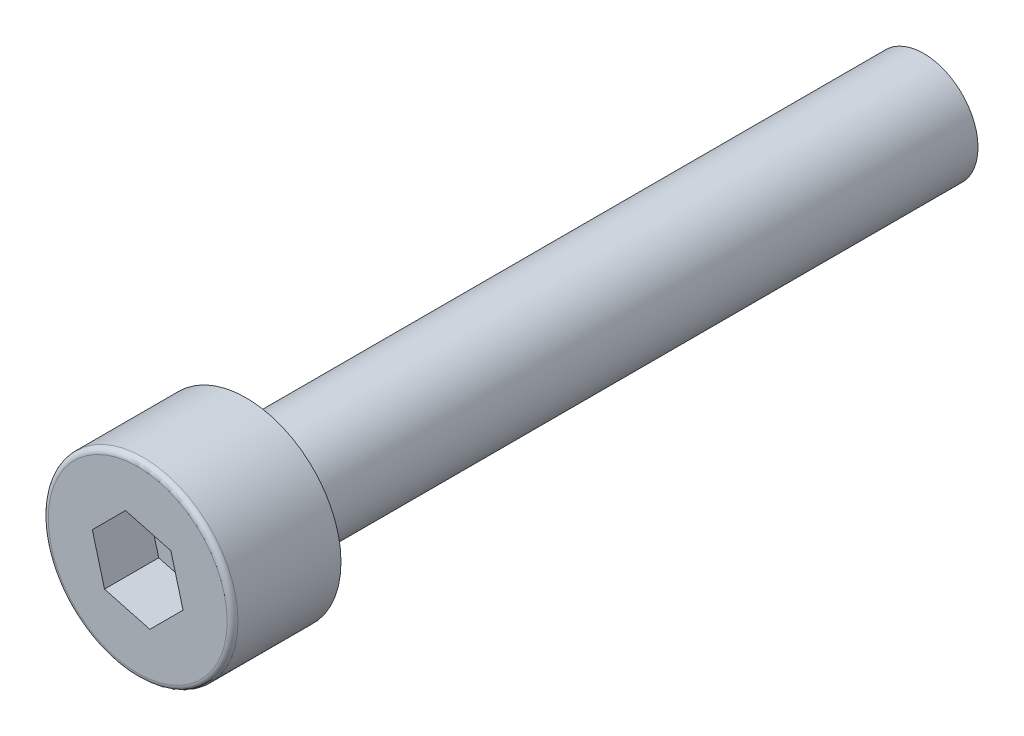
ISO-10303-21;
HEADER;
FILE_DESCRIPTION(('STEP AP214'),'2;1');
FILE_NAME('part.step','',(''),(''),'','','');
FILE_SCHEMA(('AUTOMOTIVE_DESIGN { 1 0 10303 214 1 1 1 1 }'));
ENDSEC;
DATA;
#1=APPLICATION_CONTEXT('core data for automotive mechanical design processes');
#2=APPLICATION_PROTOCOL_DEFINITION('international standard','automotive_design',2000,#1);
#3=PRODUCT_CONTEXT('',#1,'mechanical');
#4=PRODUCT('Part','Part','',(#3));
#5=PRODUCT_RELATED_PRODUCT_CATEGORY('part','',(#4));
#6=PRODUCT_DEFINITION_FORMATION('','',#4);
#7=PRODUCT_DEFINITION_CONTEXT('part definition',#1,'design');
#8=PRODUCT_DEFINITION('design','',#6,#7);
#9=PRODUCT_DEFINITION_SHAPE('','',#8);
#10=(LENGTH_UNIT() NAMED_UNIT(*) SI_UNIT(.MILLI.,.METRE.));
#11=(NAMED_UNIT(*) PLANE_ANGLE_UNIT() SI_UNIT($,.RADIAN.));
#12=(NAMED_UNIT(*) SI_UNIT($,.STERADIAN.) SOLID_ANGLE_UNIT());
#13=UNCERTAINTY_MEASURE_WITH_UNIT(LENGTH_MEASURE(1.E-05),#10,'distance_accuracy_value','');
#14=(GEOMETRIC_REPRESENTATION_CONTEXT(3) GLOBAL_UNCERTAINTY_ASSIGNED_CONTEXT((#13)) GLOBAL_UNIT_ASSIGNED_CONTEXT((#10,
#11,#12)) REPRESENTATION_CONTEXT('',''));
#15=CARTESIAN_POINT('',(0.,0.,0.));
#16=DIRECTION('',(0.,0.,1.));
#17=DIRECTION('',(1.,0.,0.));
#18=AXIS2_PLACEMENT_3D('',#15,#16,#17);
#19=CARTESIAN_POINT('',(0.,0.,0.));
#20=DIRECTION('',(0.,0.,1.));
#21=DIRECTION('',(1.,0.,0.));
#22=AXIS2_PLACEMENT_3D('',#19,#20,#21);
#23=PLANE('',#22);
#24=CARTESIAN_POINT('',(0.,0.,0.));
#25=DIRECTION('',(0.,0.,1.));
#26=DIRECTION('',(1.,0.,0.));
#27=AXIS2_PLACEMENT_3D('',#24,#25,#26);
#28=CIRCLE('',#27,3.5);
#29=CARTESIAN_POINT('',(3.5,0.,0.));
#30=VERTEX_POINT('',#29);
#31=EDGE_CURVE('E137',#30,#30,#28,.T.);
#32=ORIENTED_EDGE('',*,*,#31,.F.);
#33=EDGE_LOOP('',(#32));
#34=FACE_BOUND('',#33,.T.);
#35=CARTESIAN_POINT('',(0.,0.,0.));
#36=DIRECTION('',(0.,0.,1.));
#37=DIRECTION('',(1.,0.,0.));
#38=AXIS2_PLACEMENT_3D('',#35,#36,#37);
#39=CIRCLE('',#38,2.);
#40=CARTESIAN_POINT('',(2.,0.,0.));
#41=VERTEX_POINT('',#40);
#42=EDGE_CURVE('E145',#41,#41,#39,.F.);
#43=ORIENTED_EDGE('',*,*,#42,.F.);
#44=EDGE_LOOP('',(#43));
#45=FACE_BOUND('',#44,.T.);
#46=ADVANCED_FACE('F34',(#34,#45),#23,.F.);
#47=CARTESIAN_POINT('',(0.,0.,4.));
#48=DIRECTION('',(0.,0.,-1.));
#49=DIRECTION('',(-1.,0.,0.));
#50=AXIS2_PLACEMENT_3D('',#47,#48,#49);
#51=CYLINDRICAL_SURFACE('',#50,3.5);
#52=CARTESIAN_POINT('',(0.,0.,3.8));
#53=DIRECTION('',(0.,0.,1.));
#54=DIRECTION('',(1.,0.,0.));
#55=AXIS2_PLACEMENT_3D('',#52,#53,#54);
#56=CIRCLE('',#55,3.5);
#57=CARTESIAN_POINT('',(3.5,0.,3.8));
#58=VERTEX_POINT('',#57);
#59=EDGE_CURVE('E11',#58,#58,#56,.F.);
#60=ORIENTED_EDGE('',*,*,#59,.T.);
#61=EDGE_LOOP('',(#60));
#62=FACE_BOUND('',#61,.T.);
#63=ORIENTED_EDGE('',*,*,#31,.T.);
#64=EDGE_LOOP('',(#63));
#65=FACE_BOUND('',#64,.T.);
#66=ADVANCED_FACE('F164',(#62,#65),#51,.T.);
#67=CARTESIAN_POINT('',(0.,0.,4.));
#68=DIRECTION('',(0.,0.,1.));
#69=DIRECTION('',(1.,0.,0.));
#70=AXIS2_PLACEMENT_3D('',#67,#68,#69);
#71=PLANE('',#70);
#72=CARTESIAN_POINT('',(0.,0.,4.));
#73=DIRECTION('',(0.,0.,1.));
#74=DIRECTION('',(1.,0.,0.));
#75=AXIS2_PLACEMENT_3D('',#72,#73,#74);
#76=CIRCLE('',#75,3.3);
#77=CARTESIAN_POINT('',(3.3,0.,4.));
#78=VERTEX_POINT('',#77);
#79=EDGE_CURVE('E42',#78,#78,#76,.T.);
#80=ORIENTED_EDGE('',*,*,#79,.T.);
#81=EDGE_LOOP('',(#80));
#82=FACE_BOUND('',#81,.T.);
#83=DIRECTION('',(0.258819045102521,-0.965925826289068,0.));
#84=VECTOR('',#83,1.);
#85=CARTESIAN_POINT('',(-1.67303260747562,0.448287736084027,4.));
#86=LINE('',#85,#84);
#87=CARTESIAN_POINT('',(-1.67303260747562,0.448287736084027,4.));
#88=VERTEX_POINT('',#87);
#89=CARTESIAN_POINT('',(-1.22474487139159,-1.22474487139159,4.));
#90=VERTEX_POINT('',#89);
#91=EDGE_CURVE('E49',#88,#90,#86,.T.);
#92=ORIENTED_EDGE('',*,*,#91,.F.);
#93=DIRECTION('',(-0.707106781186547,-0.707106781186548,0.));
#94=VECTOR('',#93,1.);
#95=CARTESIAN_POINT('',(-0.448287736084027,1.67303260747562,4.));
#96=LINE('',#95,#94);
#97=CARTESIAN_POINT('',(-0.448287736084027,1.67303260747562,4.));
#98=VERTEX_POINT('',#97);
#99=EDGE_CURVE('E133',#98,#88,#96,.T.);
#100=ORIENTED_EDGE('',*,*,#99,.F.);
#101=DIRECTION('',(-0.965925826289068,0.258819045102521,0.));
#102=VECTOR('',#101,1.);
#103=CARTESIAN_POINT('',(1.22474487139159,1.22474487139159,4.));
#104=LINE('',#103,#102);
#105=CARTESIAN_POINT('',(1.22474487139159,1.22474487139159,4.));
#106=VERTEX_POINT('',#105);
#107=EDGE_CURVE('E131',#106,#98,#104,.T.);
#108=ORIENTED_EDGE('',*,*,#107,.F.);
#109=DIRECTION('',(-0.258819045102521,0.965925826289068,0.));
#110=VECTOR('',#109,1.);
#111=CARTESIAN_POINT('',(1.67303260747562,-0.448287736084027,4.));
#112=LINE('',#111,#110);
#113=CARTESIAN_POINT('',(1.67303260747562,-0.448287736084027,4.));
#114=VERTEX_POINT('',#113);
#115=EDGE_CURVE('E97',#114,#106,#112,.T.);
#116=ORIENTED_EDGE('',*,*,#115,.F.);
#117=DIRECTION('',(0.707106781186547,0.707106781186548,0.));
#118=VECTOR('',#117,1.);
#119=CARTESIAN_POINT('',(0.448287736084026,-1.67303260747562,4.));
#120=LINE('',#119,#118);
#121=CARTESIAN_POINT('',(0.448287736084026,-1.67303260747562,4.));
#122=VERTEX_POINT('',#121);
#123=EDGE_CURVE('E127',#122,#114,#120,.T.);
#124=ORIENTED_EDGE('',*,*,#123,.F.);
#125=DIRECTION('',(0.965925826289068,-0.258819045102521,0.));
#126=VECTOR('',#125,1.);
#127=CARTESIAN_POINT('',(-1.22474487139159,-1.22474487139159,4.));
#128=LINE('',#127,#126);
#129=EDGE_CURVE('E123',#90,#122,#128,.T.);
#130=ORIENTED_EDGE('',*,*,#129,.F.);
#131=EDGE_LOOP('',(#92,#100,#108,#116,#124,#130));
#132=FACE_BOUND('',#131,.T.);
#133=ADVANCED_FACE('F150',(#82,#132),#71,.T.);
#134=CARTESIAN_POINT('',(-1.67303260747562,0.448287736084027,2.));
#135=DIRECTION('',(-0.965925826289068,-0.258819045102521,0.));
#136=DIRECTION('',(0.258819045102521,-0.965925826289068,0.));
#137=AXIS2_PLACEMENT_3D('',#134,#135,#136);
#138=PLANE('',#137);
#139=ORIENTED_EDGE('',*,*,#91,.T.);
#140=DIRECTION('',(0.,0.,1.));
#141=VECTOR('',#140,1.);
#142=CARTESIAN_POINT('',(-1.22474487139159,-1.22474487139159,2.));
#143=LINE('',#142,#141);
#144=CARTESIAN_POINT('',(-1.22474487139159,-1.22474487139159,2.));
#145=VERTEX_POINT('',#144);
#146=EDGE_CURVE('E79',#145,#90,#143,.T.);
#147=ORIENTED_EDGE('',*,*,#146,.F.);
#148=DIRECTION('',(0.258819045102521,-0.965925826289068,0.));
#149=VECTOR('',#148,1.);
#150=CARTESIAN_POINT('',(-1.67303260747562,0.448287736084027,2.));
#151=LINE('',#150,#149);
#152=CARTESIAN_POINT('',(-1.67303260747562,0.448287736084027,2.));
#153=VERTEX_POINT('',#152);
#154=EDGE_CURVE('E135',#153,#145,#151,.T.);
#155=ORIENTED_EDGE('',*,*,#154,.F.);
#156=DIRECTION('',(0.,0.,1.));
#157=VECTOR('',#156,1.);
#158=CARTESIAN_POINT('',(-1.67303260747562,0.448287736084027,2.));
#159=LINE('',#158,#157);
#160=EDGE_CURVE('E57',#153,#88,#159,.T.);
#161=ORIENTED_EDGE('',*,*,#160,.T.);
#162=EDGE_LOOP('',(#139,#147,#155,#161));
#163=FACE_BOUND('',#162,.T.);
#164=ADVANCED_FACE('F176',(#163),#138,.F.);
#165=CARTESIAN_POINT('',(-0.448287736084027,1.67303260747562,2.));
#166=DIRECTION('',(-0.707106781186548,0.707106781186547,0.));
#167=DIRECTION('',(-0.707106781186547,-0.707106781186548,0.));
#168=AXIS2_PLACEMENT_3D('',#165,#166,#167);
#169=PLANE('',#168);
#170=ORIENTED_EDGE('',*,*,#99,.T.);
#171=ORIENTED_EDGE('',*,*,#160,.F.);
#172=DIRECTION('',(-0.707106781186547,-0.707106781186548,0.));
#173=VECTOR('',#172,1.);
#174=CARTESIAN_POINT('',(-0.448287736084027,1.67303260747562,2.));
#175=LINE('',#174,#173);
#176=CARTESIAN_POINT('',(-0.448287736084027,1.67303260747562,2.));
#177=VERTEX_POINT('',#176);
#178=EDGE_CURVE('E109',#177,#153,#175,.T.);
#179=ORIENTED_EDGE('',*,*,#178,.F.);
#180=DIRECTION('',(0.,0.,1.));
#181=VECTOR('',#180,1.);
#182=CARTESIAN_POINT('',(-0.448287736084027,1.67303260747562,2.));
#183=LINE('',#182,#181);
#184=EDGE_CURVE('E101',#177,#98,#183,.T.);
#185=ORIENTED_EDGE('',*,*,#184,.T.);
#186=EDGE_LOOP('',(#170,#171,#179,#185));
#187=FACE_BOUND('',#186,.T.);
#188=ADVANCED_FACE('F179',(#187),#169,.F.);
#189=CARTESIAN_POINT('',(1.22474487139159,1.22474487139159,2.));
#190=DIRECTION('',(0.258819045102521,0.965925826289068,0.));
#191=DIRECTION('',(-0.965925826289068,0.258819045102521,0.));
#192=AXIS2_PLACEMENT_3D('',#189,#190,#191);
#193=PLANE('',#192);
#194=ORIENTED_EDGE('',*,*,#107,.T.);
#195=ORIENTED_EDGE('',*,*,#184,.F.);
#196=DIRECTION('',(-0.965925826289068,0.258819045102521,0.));
#197=VECTOR('',#196,1.);
#198=CARTESIAN_POINT('',(1.22474487139159,1.22474487139159,2.));
#199=LINE('',#198,#197);
#200=CARTESIAN_POINT('',(1.22474487139159,1.22474487139159,2.));
#201=VERTEX_POINT('',#200);
#202=EDGE_CURVE('E105',#201,#177,#199,.T.);
#203=ORIENTED_EDGE('',*,*,#202,.F.);
#204=DIRECTION('',(0.,0.,1.));
#205=VECTOR('',#204,1.);
#206=CARTESIAN_POINT('',(1.22474487139159,1.22474487139159,2.));
#207=LINE('',#206,#205);
#208=EDGE_CURVE('E90',#201,#106,#207,.T.);
#209=ORIENTED_EDGE('',*,*,#208,.T.);
#210=EDGE_LOOP('',(#194,#195,#203,#209));
#211=FACE_BOUND('',#210,.T.);
#212=ADVANCED_FACE('F106',(#211),#193,.F.);
#213=CARTESIAN_POINT('',(1.67303260747562,-0.448287736084027,2.));
#214=DIRECTION('',(0.965925826289068,0.258819045102521,0.));
#215=DIRECTION('',(-0.258819045102521,0.965925826289068,0.));
#216=AXIS2_PLACEMENT_3D('',#213,#214,#215);
#217=PLANE('',#216);
#218=ORIENTED_EDGE('',*,*,#115,.T.);
#219=ORIENTED_EDGE('',*,*,#208,.F.);
#220=DIRECTION('',(-0.258819045102521,0.965925826289068,0.));
#221=VECTOR('',#220,1.);
#222=CARTESIAN_POINT('',(1.67303260747562,-0.448287736084027,2.));
#223=LINE('',#222,#221);
#224=CARTESIAN_POINT('',(1.67303260747562,-0.448287736084027,2.));
#225=VERTEX_POINT('',#224);
#226=EDGE_CURVE('E94',#225,#201,#223,.T.);
#227=ORIENTED_EDGE('',*,*,#226,.F.);
#228=DIRECTION('',(0.,0.,1.));
#229=VECTOR('',#228,1.);
#230=CARTESIAN_POINT('',(1.67303260747562,-0.448287736084027,2.));
#231=LINE('',#230,#229);
#232=EDGE_CURVE('E102',#225,#114,#231,.T.);
#233=ORIENTED_EDGE('',*,*,#232,.T.);
#234=EDGE_LOOP('',(#218,#219,#227,#233));
#235=FACE_BOUND('',#234,.T.);
#236=ADVANCED_FACE('F92',(#235),#217,.F.);
#237=CARTESIAN_POINT('',(0.448287736084026,-1.67303260747562,2.));
#238=DIRECTION('',(0.707106781186548,-0.707106781186547,0.));
#239=DIRECTION('',(0.707106781186547,0.707106781186548,0.));
#240=AXIS2_PLACEMENT_3D('',#237,#238,#239);
#241=PLANE('',#240);
#242=ORIENTED_EDGE('',*,*,#123,.T.);
#243=ORIENTED_EDGE('',*,*,#232,.F.);
#244=DIRECTION('',(0.707106781186547,0.707106781186548,0.));
#245=VECTOR('',#244,1.);
#246=CARTESIAN_POINT('',(0.448287736084026,-1.67303260747562,2.));
#247=LINE('',#246,#245);
#248=CARTESIAN_POINT('',(0.448287736084026,-1.67303260747562,2.));
#249=VERTEX_POINT('',#248);
#250=EDGE_CURVE('E115',#249,#225,#247,.T.);
#251=ORIENTED_EDGE('',*,*,#250,.F.);
#252=DIRECTION('',(0.,0.,1.));
#253=VECTOR('',#252,1.);
#254=CARTESIAN_POINT('',(0.448287736084026,-1.67303260747562,2.));
#255=LINE('',#254,#253);
#256=EDGE_CURVE('E140',#249,#122,#255,.T.);
#257=ORIENTED_EDGE('',*,*,#256,.T.);
#258=EDGE_LOOP('',(#242,#243,#251,#257));
#259=FACE_BOUND('',#258,.T.);
#260=ADVANCED_FACE('F183',(#259),#241,.F.);
#261=CARTESIAN_POINT('',(-1.22474487139159,-1.22474487139159,2.));
#262=DIRECTION('',(-0.258819045102521,-0.965925826289068,0.));
#263=DIRECTION('',(0.965925826289068,-0.258819045102521,0.));
#264=AXIS2_PLACEMENT_3D('',#261,#262,#263);
#265=PLANE('',#264);
#266=ORIENTED_EDGE('',*,*,#129,.T.);
#267=ORIENTED_EDGE('',*,*,#256,.F.);
#268=DIRECTION('',(0.965925826289068,-0.258819045102521,0.));
#269=VECTOR('',#268,1.);
#270=CARTESIAN_POINT('',(-1.22474487139159,-1.22474487139159,2.));
#271=LINE('',#270,#269);
#272=EDGE_CURVE('E117',#145,#249,#271,.T.);
#273=ORIENTED_EDGE('',*,*,#272,.F.);
#274=ORIENTED_EDGE('',*,*,#146,.T.);
#275=EDGE_LOOP('',(#266,#267,#273,#274));
#276=FACE_BOUND('',#275,.T.);
#277=ADVANCED_FACE('F180',(#276),#265,.F.);
#278=CARTESIAN_POINT('',(0.,0.,2.));
#279=DIRECTION('',(0.,0.,1.));
#280=DIRECTION('',(1.,0.,0.));
#281=AXIS2_PLACEMENT_3D('',#278,#279,#280);
#282=PLANE('',#281);
#283=ORIENTED_EDGE('',*,*,#154,.T.);
#284=ORIENTED_EDGE('',*,*,#272,.T.);
#285=ORIENTED_EDGE('',*,*,#250,.T.);
#286=ORIENTED_EDGE('',*,*,#226,.T.);
#287=ORIENTED_EDGE('',*,*,#202,.T.);
#288=ORIENTED_EDGE('',*,*,#178,.T.);
#289=EDGE_LOOP('',(#283,#284,#285,#286,#287,#288));
#290=FACE_BOUND('',#289,.T.);
#291=ADVANCED_FACE('F112',(#290),#282,.T.);
#292=CARTESIAN_POINT('',(0.,0.,-25.));
#293=DIRECTION('',(0.,0.,1.));
#294=DIRECTION('',(1.,0.,0.));
#295=AXIS2_PLACEMENT_3D('',#292,#293,#294);
#296=CYLINDRICAL_SURFACE('',#295,2.);
#297=CARTESIAN_POINT('',(0.,0.,-25.));
#298=DIRECTION('',(0.,0.,-1.));
#299=DIRECTION('',(-1.,0.,0.));
#300=AXIS2_PLACEMENT_3D('',#297,#298,#299);
#301=CIRCLE('',#300,2.);
#302=CARTESIAN_POINT('',(-2.,0.,-25.));
#303=VERTEX_POINT('',#302);
#304=EDGE_CURVE('E124',#303,#303,#301,.T.);
#305=ORIENTED_EDGE('',*,*,#304,.F.);
#306=EDGE_LOOP('',(#305));
#307=FACE_BOUND('',#306,.T.);
#308=ORIENTED_EDGE('',*,*,#42,.T.);
#309=EDGE_LOOP('',(#308));
#310=FACE_BOUND('',#309,.T.);
#311=ADVANCED_FACE('F159',(#307,#310),#296,.T.);
#312=CARTESIAN_POINT('',(0.,0.,-25.));
#313=DIRECTION('',(0.,0.,-1.));
#314=DIRECTION('',(-1.,0.,0.));
#315=AXIS2_PLACEMENT_3D('',#312,#313,#314);
#316=PLANE('',#315);
#317=ORIENTED_EDGE('',*,*,#304,.T.);
#318=EDGE_LOOP('',(#317));
#319=FACE_BOUND('',#318,.T.);
#320=ADVANCED_FACE('F154',(#319),#316,.T.);
#321=CARTESIAN_POINT('',(0.,0.,3.8));
#322=DIRECTION('',(0.,0.,1.));
#323=DIRECTION('',(1.,0.,0.));
#324=AXIS2_PLACEMENT_3D('',#321,#322,#323);
#325=TOROIDAL_SURFACE('',#324,3.3,0.2);
#326=ORIENTED_EDGE('',*,*,#59,.F.);
#327=EDGE_LOOP('',(#326));
#328=FACE_BOUND('',#327,.T.);
#329=ORIENTED_EDGE('',*,*,#79,.F.);
#330=EDGE_LOOP('',(#329));
#331=FACE_BOUND('',#330,.T.);
#332=ADVANCED_FACE('F36',(#328,#331),#325,.T.);
#333=CLOSED_SHELL('',(#46,#66,#133,#164,#188,#212,#236,#260,#277,#291,#311,#320,#332));
#334=MANIFOLD_SOLID_BREP('B2',#333);
#335=ADVANCED_BREP_SHAPE_REPRESENTATION('',(#18,#334),#14);
#336=SHAPE_DEFINITION_REPRESENTATION(#9,#335);
ENDSEC;
END-ISO-10303-21;
